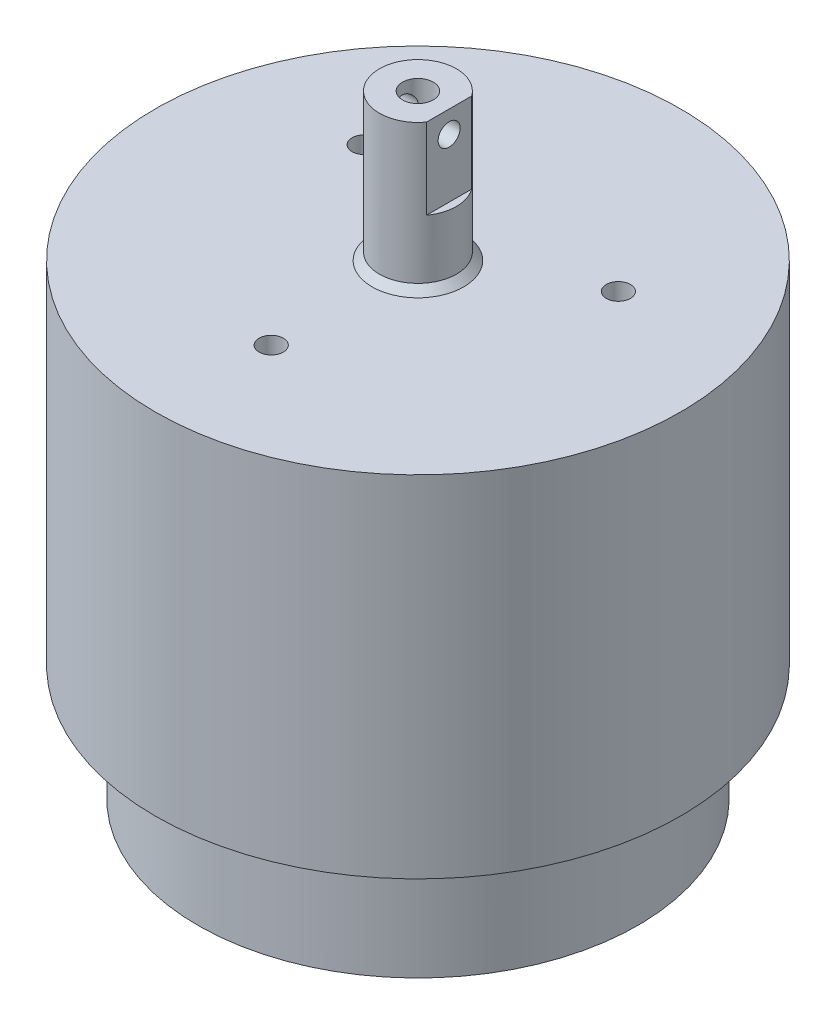
ISO-10303-21;
HEADER;
FILE_DESCRIPTION(('STEP AP214'),'2;1');
FILE_NAME('part.step','',(''),(''),'','','');
FILE_SCHEMA(('AUTOMOTIVE_DESIGN { 1 0 10303 214 1 1 1 1 }'));
ENDSEC;
DATA;
#1=APPLICATION_CONTEXT('core data for automotive mechanical design processes');
#2=APPLICATION_PROTOCOL_DEFINITION('international standard','automotive_design',2000,#1);
#3=PRODUCT_CONTEXT('',#1,'mechanical');
#4=PRODUCT('Part','Part','',(#3));
#5=PRODUCT_RELATED_PRODUCT_CATEGORY('part','',(#4));
#6=PRODUCT_DEFINITION_FORMATION('','',#4);
#7=PRODUCT_DEFINITION_CONTEXT('part definition',#1,'design');
#8=PRODUCT_DEFINITION('design','',#6,#7);
#9=PRODUCT_DEFINITION_SHAPE('','',#8);
#10=(LENGTH_UNIT() NAMED_UNIT(*) SI_UNIT(.MILLI.,.METRE.));
#11=(NAMED_UNIT(*) PLANE_ANGLE_UNIT() SI_UNIT($,.RADIAN.));
#12=(NAMED_UNIT(*) SI_UNIT($,.STERADIAN.) SOLID_ANGLE_UNIT());
#13=UNCERTAINTY_MEASURE_WITH_UNIT(LENGTH_MEASURE(1.E-05),#10,'distance_accuracy_value','');
#14=(GEOMETRIC_REPRESENTATION_CONTEXT(3) GLOBAL_UNCERTAINTY_ASSIGNED_CONTEXT((#13)) GLOBAL_UNIT_ASSIGNED_CONTEXT((#10,
#11,#12)) REPRESENTATION_CONTEXT('',''));
#15=CARTESIAN_POINT('',(0.,0.,0.));
#16=DIRECTION('',(0.,0.,1.));
#17=DIRECTION('',(1.,0.,0.));
#18=AXIS2_PLACEMENT_3D('',#15,#16,#17);
#19=CARTESIAN_POINT('',(0.,0.,0.));
#20=DIRECTION('',(0.,1.,0.));
#21=DIRECTION('',(0.,0.,1.));
#22=AXIS2_PLACEMENT_3D('',#19,#20,#21);
#23=PLANE('',#22);
#24=DIRECTION('',(1.,0.,0.));
#25=VECTOR('',#24,1.);
#26=CARTESIAN_POINT('',(-68.4,0.,-26.8));
#27=LINE('',#26,#25);
#28=CARTESIAN_POINT('',(-13.4818396370822,0.,-26.8));
#29=VERTEX_POINT('',#28);
#30=CARTESIAN_POINT('',(13.4818396370822,0.,-26.8));
#31=VERTEX_POINT('',#30);
#32=EDGE_CURVE('E52',#29,#31,#27,.T.);
#33=ORIENTED_EDGE('',*,*,#32,.F.);
#34=CARTESIAN_POINT('',(0.,0.,0.));
#35=DIRECTION('',(0.,1.,0.));
#36=DIRECTION('',(0.,0.,1.));
#37=AXIS2_PLACEMENT_3D('',#34,#35,#36);
#38=CIRCLE('',#37,30.);
#39=EDGE_CURVE('E89',#31,#29,#38,.F.);
#40=ORIENTED_EDGE('',*,*,#39,.F.);
#41=EDGE_LOOP('',(#33,#40));
#42=FACE_BOUND('',#41,.T.);
#43=CARTESIAN_POINT('',(0.,0.,0.));
#44=DIRECTION('',(0.,1.,0.));
#45=DIRECTION('',(0.,0.,1.));
#46=AXIS2_PLACEMENT_3D('',#43,#44,#45);
#47=CIRCLE('',#46,35.8);
#48=CARTESIAN_POINT('',(0.,0.,35.8));
#49=VERTEX_POINT('',#48);
#50=EDGE_CURVE('E179',#49,#49,#47,.T.);
#51=ORIENTED_EDGE('',*,*,#50,.F.);
#52=EDGE_LOOP('',(#51));
#53=FACE_BOUND('',#52,.T.);
#54=ADVANCED_FACE('F38',(#42,#53),#23,.F.);
#55=CARTESIAN_POINT('',(-35.8,64.7,0.));
#56=DIRECTION('',(1.,0.,0.));
#57=DIRECTION('',(0.,0.,-1.));
#58=AXIS2_PLACEMENT_3D('',#55,#56,#57);
#59=CYLINDRICAL_SURFACE('',#58,1.5);
#60=CARTESIAN_POINT('',(-1.46969384566991,64.7,-1.5));
#61=CARTESIAN_POINT('',(-1.46969165930968,64.7714635636139,-1.50000136654578));
#62=CARTESIAN_POINT('',(-1.47500932637416,64.8429207403161,-1.49484568464259));
#63=CARTESIAN_POINT('',(-1.49509778142078,64.9831501533784,-1.47474413498796));
#64=CARTESIAN_POINT('',(-1.50989183818347,65.0519153374449,-1.45977416663717));
#65=CARTESIAN_POINT('',(-1.54608690956729,65.184150557969,-1.42137043457249));
#66=CARTESIAN_POINT('',(-1.56740847183025,65.2476732010485,-1.39803790596236));
#67=CARTESIAN_POINT('',(-1.61411338226234,65.3697344167392,-1.34384442045294));
#68=CARTESIAN_POINT('',(-1.63949657223534,65.4282731833312,-1.31298375674207));
#69=CARTESIAN_POINT('',(-1.69703920681543,65.5505097655526,-1.23801434968526));
#70=CARTESIAN_POINT('',(-1.72958548266557,65.6131709629904,-1.19251231937905));
#71=CARTESIAN_POINT('',(-1.79453481625315,65.7309030748407,-1.09234569430987));
#72=CARTESIAN_POINT('',(-1.82693762546001,65.7859637671573,-1.03766897496788));
#73=CARTESIAN_POINT('',(-1.89464454418695,65.8966278927636,-0.909114118883169));
#74=CARTESIAN_POINT('',(-1.92945000277546,65.9506089564553,-0.833550251339773));
#75=CARTESIAN_POINT('',(-1.99163539004082,66.0445616887617,-0.671471184072257));
#76=CARTESIAN_POINT('',(-2.01903090484714,66.0845628155065,-0.584979541461412));
#77=CARTESIAN_POINT('',(-2.0568573791985,66.1390714423057,-0.428823654563336));
#78=CARTESIAN_POINT('',(-2.06988765494728,66.157575484144,-0.361173149474201));
#79=CARTESIAN_POINT('',(-2.08928275459017,66.184991166103,-0.223037025629692));
#80=CARTESIAN_POINT('',(-2.09565302694576,66.1939106473936,-0.15255377341014));
#81=CARTESIAN_POINT('',(-2.10117694036723,66.2016496965512,-0.0105972322099037));
#82=CARTESIAN_POINT('',(-2.10031527792017,66.2004478466291,0.0608778365420269));
#83=CARTESIAN_POINT('',(-2.09141900536098,66.1879691760126,0.202492055658266));
#84=CARTESIAN_POINT('',(-2.08338248354529,66.1766896701791,0.272630844890636));
#85=CARTESIAN_POINT('',(-2.06113132668599,66.1451239567931,0.407816198169333));
#86=CARTESIAN_POINT('',(-2.04708263262734,66.1250793700523,0.472947719355316));
#87=CARTESIAN_POINT('',(-2.01388317467698,66.0769633290989,0.598759663359012));
#88=CARTESIAN_POINT('',(-1.99473137301589,66.0488902421232,0.659439177610707));
#89=CARTESIAN_POINT('',(-1.95018428161982,65.9821488941787,0.781979515918934));
#90=CARTESIAN_POINT('',(-1.92433092548092,65.9426482445541,0.843217563738527));
#91=CARTESIAN_POINT('',(-1.86956492969856,65.8560275902243,0.958546642695754));
#92=CARTESIAN_POINT('',(-1.84064919856859,65.8088998601011,1.01263032520683));
#93=CARTESIAN_POINT('',(-1.77613984520874,65.6985214290082,1.12253959533404));
#94=CARTESIAN_POINT('',(-1.74029823421898,65.6339002110004,1.1768465307683));
#95=CARTESIAN_POINT('',(-1.67027791346609,65.4958482268797,1.27426961124233));
#96=CARTESIAN_POINT('',(-1.6360991117621,65.4224179486216,1.31738637558721));
#97=CARTESIAN_POINT('',(-1.5807777200218,65.2847012905478,1.38295023832981));
#98=CARTESIAN_POINT('',(-1.55843290737092,65.2220812754251,1.40786555789215));
#99=CARTESIAN_POINT('',(-1.51991323882907,65.0923666770235,1.4493682425193));
#100=CARTESIAN_POINT('',(-1.50372697519068,65.0252806399897,1.46597102346706));
#101=CARTESIAN_POINT('',(-1.47997847836866,64.8870650724588,1.48995559401033));
#102=CARTESIAN_POINT('',(-1.47251842056757,64.8158976759758,1.49722823022055));
#103=CARTESIAN_POINT('',(-1.46821177064601,64.6729509624099,1.50145580341694));
#104=CARTESIAN_POINT('',(-1.47135761475232,64.6011721178168,1.49841809338555));
#105=CARTESIAN_POINT('',(-1.4862179505167,64.4711657218677,1.48365443178122));
#106=CARTESIAN_POINT('',(-1.4964991965727,64.4125897811243,1.47337792994044));
#107=CARTESIAN_POINT('',(-1.52260578901432,64.2982114735756,1.44638320728362));
#108=CARTESIAN_POINT('',(-1.53843765878242,64.2424124588593,1.42965740459433));
#109=CARTESIAN_POINT('',(-1.58254090823628,64.108243566708,1.38097343084555));
#110=CARTESIAN_POINT('',(-1.61313549796306,64.0318968007285,1.34555737538804));
#111=CARTESIAN_POINT('',(-1.67819313243434,63.8872776876105,1.26349530316507));
#112=CARTESIAN_POINT('',(-1.71266384591532,63.8190219159808,1.21682680768471));
#113=CARTESIAN_POINT('',(-1.78263899408262,63.6896444385997,1.111876746708));
#114=CARTESIAN_POINT('',(-1.81814914820308,63.6287195316445,1.05335590564381));
#115=CARTESIAN_POINT('',(-1.8861982097656,63.5169093019218,0.925990119024709));
#116=CARTESIAN_POINT('',(-1.91874117814137,63.466010143529,0.857159635254306));
#117=CARTESIAN_POINT('',(-1.97355695532268,63.3825173160364,0.72086207062022));
#118=CARTESIAN_POINT('',(-1.9966369574586,63.3483291724234,0.654701792827803));
#119=CARTESIAN_POINT('',(-2.03677203003265,63.2897171605615,0.516456587915639));
#120=CARTESIAN_POINT('',(-2.05383052732656,63.2652877375508,0.444375059484916));
#121=CARTESIAN_POINT('',(-2.08048595093181,63.2273813967837,0.295508306422581));
#122=CARTESIAN_POINT('',(-2.09003481122841,63.2139750083805,0.218696121210112));
#123=CARTESIAN_POINT('',(-2.10048455576969,63.1993123233693,0.063345450159648));
#124=CARTESIAN_POINT('',(-2.10138999521387,63.198049626869,-0.0151921045079223));
#125=CARTESIAN_POINT('',(-2.09484940357417,63.2072173341615,-0.162689602153977));
#126=CARTESIAN_POINT('',(-2.08829003391129,63.2164062433253,-0.231772127939286));
#127=CARTESIAN_POINT('',(-2.06879045843107,63.2439818401701,-0.367128348695411));
#128=CARTESIAN_POINT('',(-2.05584917022157,63.2623700880937,-0.433401565127795));
#129=CARTESIAN_POINT('',(-2.02420489180258,63.307993665386,-0.563173310350435));
#130=CARTESIAN_POINT('',(-2.00537359742541,63.3354268252546,-0.626569976308402));
#131=CARTESIAN_POINT('',(-1.96336858423812,63.3979433720807,-0.747870090713514));
#132=CARTESIAN_POINT('',(-1.94019406405212,63.4330281710508,-0.805772522435653));
#133=CARTESIAN_POINT('',(-1.88707875962302,63.515841562924,-0.923986959254949));
#134=CARTESIAN_POINT('',(-1.85664563422283,63.564685505515,-0.983294495655166));
#135=CARTESIAN_POINT('',(-1.79399906606271,63.6703187138756,-1.0934320888604));
#136=CARTESIAN_POINT('',(-1.76178239308847,63.7271227012664,-1.14424604653133));
#137=CARTESIAN_POINT('',(-1.69251482816939,63.8584199117439,-1.24487931564336));
#138=CARTESIAN_POINT('',(-1.65558627022475,63.9342749797694,-1.29302213478842));
#139=CARTESIAN_POINT('',(-1.58751047818561,64.0954416102156,-1.37574602319549));
#140=CARTESIAN_POINT('',(-1.55635298353236,64.1807359502617,-1.4103512855809));
#141=CARTESIAN_POINT('',(-1.51212917512403,64.3383474061182,-1.45748481316448));
#142=CARTESIAN_POINT('',(-1.49652391532485,64.4089374180378,-1.47330401471641));
#143=CARTESIAN_POINT('',(-1.47532311152695,64.5530271370526,-1.49454455651674));
#144=CARTESIAN_POINT('',(-1.46969609381458,64.6265169450203,-1.49999859483696));
#145=CARTESIAN_POINT('',(-1.46969384566991,64.7,-1.5));
#146=B_SPLINE_CURVE_WITH_KNOTS('',3,(#60,#61,#62,#63,#64,#65,#66,#67,#68,#69,#70,#71,#72,#73,
#74,#75,#76,#77,#78,#79,#80,#81,#82,#83,#84,#85,#86,#87,#88,#89,#90,#91,#92,#93,#94,#95,#96,#97,
#98,#99,#100,#101,#102,#103,#104,#105,#106,#107,#108,#109,#110,#111,#112,#113,#114,#115,#116,
#117,#118,#119,#120,#121,#122,#123,#124,#125,#126,#127,#128,#129,#130,#131,#132,#133,#134,#135,
#136,#137,#138,#139,#140,#141,#142,#143,#144,#145),.UNSPECIFIED.,.T.,.F.,(4,2,2,2,2,2,2,2,2,2,2,
2,2,2,2,2,2,2,2,2,2,2,2,2,2,2,2,2,2,2,2,2,2,2,2,2,2,2,2,2,2,2,4),(0.,0.214041341565737,
0.428610275712231,0.640664871601888,0.852711210197116,1.1038257335541,1.35527476295182,
1.65114310955598,1.94638419755255,2.15947902773156,2.37239939108386,2.58577042909477,
2.79919833566905,3.00708108528785,3.21500614230807,3.44611668475213,3.6774627996914,
3.95147971727035,4.22548146651265,4.43776026411788,4.64964391165515,4.86398443491504,
5.07817213005319,5.25849876334789,5.43903804027736,5.70624218404043,5.97398460292707,
6.24779650448657,6.52122785421028,6.75417807949538,6.98699551758335,7.22129126143327,
7.45546352144085,7.66448115880025,7.87353425836437,8.08750217454558,8.30150960924386,
8.54850648356673,8.79596634520385,9.08601786485981,9.37554863589217,9.59633624226799,
9.81642618565758),.UNSPECIFIED.);
#147=CARTESIAN_POINT('',(-1.46969384566991,64.7,-1.5));
#148=VERTEX_POINT('',#147);
#149=EDGE_CURVE('E98',#148,#148,#146,.T.);
#150=ORIENTED_EDGE('',*,*,#149,.T.);
#151=EDGE_LOOP('',(#150));
#152=FACE_BOUND('',#151,.T.);
#153=CARTESIAN_POINT('',(-5.03115294937453,64.7,-1.5));
#154=CARTESIAN_POINT('',(-5.03115410257282,64.7823886534079,-1.49999851534795));
#155=CARTESIAN_POINT('',(-5.03319884759406,64.8647923131909,-1.49318899949663));
#156=CARTESIAN_POINT('',(-5.04112791905326,65.0272034291472,-1.46619272542646));
#157=CARTESIAN_POINT('',(-5.04701380722367,65.1072098968255,-1.4460005260225));
#158=CARTESIAN_POINT('',(-5.06190532141159,65.2624529006536,-1.3929700746965));
#159=CARTESIAN_POINT('',(-5.07090611443027,65.3376966138629,-1.36015140488905));
#160=CARTESIAN_POINT('',(-5.0910069082211,65.4816258586658,-1.28286273047202));
#161=CARTESIAN_POINT('',(-5.10210715818896,65.5503106102835,-1.23839134249759));
#162=CARTESIAN_POINT('',(-5.12551337410616,65.6811436739862,-1.13769360073649));
#163=CARTESIAN_POINT('',(-5.13784316973113,65.7430758515969,-1.08119190834937));
#164=CARTESIAN_POINT('',(-5.16211474134014,65.8567270874779,-0.958628434101947));
#165=CARTESIAN_POINT('',(-5.17405647175239,65.9084449498421,-0.892565534369719));
#166=CARTESIAN_POINT('',(-5.19647499001134,66.0011214862651,-0.751234524118184));
#167=CARTESIAN_POINT('',(-5.2069204087565,66.0418622148132,-0.675818087821388));
#168=CARTESIAN_POINT('',(-5.22489405364148,66.110001330812,-0.518856356429715));
#169=CARTESIAN_POINT('',(-5.23242284768149,66.1374023159302,-0.437312258156366));
#170=CARTESIAN_POINT('',(-5.24354639475177,66.1773758459298,-0.272668931340872));
#171=CARTESIAN_POINT('',(-5.24723870258477,66.1903167662785,-0.189665848596768));
#172=CARTESIAN_POINT('',(-5.2506157174477,66.2021650504124,-0.0225900768164312));
#173=CARTESIAN_POINT('',(-5.25030119054237,66.201075096753,0.0614824046914218));
#174=CARTESIAN_POINT('',(-5.2457700507248,66.1851452188115,0.225735146801425));
#175=CARTESIAN_POINT('',(-5.24166653082038,66.1707037905215,0.305957659581719));
#176=CARTESIAN_POINT('',(-5.23015414747602,66.1291286731517,0.462789166633221));
#177=CARTESIAN_POINT('',(-5.22274508292168,66.1019942118034,0.539397940725388));
#178=CARTESIAN_POINT('',(-5.20529273829083,66.0355179493911,0.687805375296698));
#179=CARTESIAN_POINT('',(-5.195221541341,65.9960459166438,0.759542282888085));
#180=CARTESIAN_POINT('',(-5.17352076730531,65.9061165602015,0.895505432692867));
#181=CARTESIAN_POINT('',(-5.16189084893963,65.8556568292502,0.959730024312011));
#182=CARTESIAN_POINT('',(-5.13784262264717,65.7430957170361,1.08122448641082));
#183=CARTESIAN_POINT('',(-5.1254109702704,65.6806479247962,1.13817118318868));
#184=CARTESIAN_POINT('',(-5.10152230340244,65.5469636811155,1.24086976181233));
#185=CARTESIAN_POINT('',(-5.09006536804024,65.4757265172883,1.28662073533696));
#186=CARTESIAN_POINT('',(-5.06936381110807,65.3257018366265,1.36592501989086));
#187=CARTESIAN_POINT('',(-5.06013758203982,65.2468585812113,1.39937803341579));
#188=CARTESIAN_POINT('',(-5.04516408290506,65.0843351273715,1.45244213622068));
#189=CARTESIAN_POINT('',(-5.03941580065156,65.0006563440051,1.47205725302032));
#190=CARTESIAN_POINT('',(-5.03226836397145,64.8338896817508,1.49630562899914));
#191=CARTESIAN_POINT('',(-5.03072783487502,64.7508786373002,1.50142611118016));
#192=CARTESIAN_POINT('',(-5.0317811969763,64.5851837630593,1.49789247539749));
#193=CARTESIAN_POINT('',(-5.03437457244426,64.5024998937418,1.48924007568482));
#194=CARTESIAN_POINT('',(-5.04326572540292,64.3417690789828,1.45883836069446));
#195=CARTESIAN_POINT('',(-5.04947732224088,64.2636593104886,1.43739346638105));
#196=CARTESIAN_POINT('',(-5.06481797948048,64.1121485960017,1.38236371399822));
#197=CARTESIAN_POINT('',(-5.07394746083355,64.0387483312658,1.34877710420076));
#198=CARTESIAN_POINT('',(-5.09437641007042,63.8967334435875,1.26946473841217));
#199=CARTESIAN_POINT('',(-5.10572398035841,63.8282821668484,1.22345918796849));
#200=CARTESIAN_POINT('',(-5.12920294912374,63.6998927199175,1.12095347763631));
#201=CARTESIAN_POINT('',(-5.14133451710709,63.6399563997409,1.06445104326102));
#202=CARTESIAN_POINT('',(-5.16551045577065,63.5282154362839,0.940281007474156));
#203=CARTESIAN_POINT('',(-5.17753804534607,63.476753771436,0.8723007826804));
#204=CARTESIAN_POINT('',(-5.19973482784499,63.385965738963,0.72838898029315));
#205=CARTESIAN_POINT('',(-5.20990411789059,63.3466387370582,0.65245781857363));
#206=CARTESIAN_POINT('',(-5.22717378634804,63.2816117847303,0.495324954717119));
#207=CARTESIAN_POINT('',(-5.23429731095436,63.2558087078104,0.414168599924721));
#208=CARTESIAN_POINT('',(-5.24477504717914,63.2182798985449,0.248434236412438));
#209=CARTESIAN_POINT('',(-5.24813022842264,63.206550544864,0.163857113689074));
#210=CARTESIAN_POINT('',(-5.25064001252463,63.1977564245017,-0.00313367846927627));
#211=CARTESIAN_POINT('',(-5.24993777691747,63.2001918881879,-0.0855192232874726));
#212=CARTESIAN_POINT('',(-5.24474301841601,63.2184787110577,-0.248658879316509));
#213=CARTESIAN_POINT('',(-5.24025067702944,63.2343294277865,-0.329413068463154));
#214=CARTESIAN_POINT('',(-5.22801601395087,63.2786985207341,-0.486303099779698));
#215=CARTESIAN_POINT('',(-5.2203031053613,63.307102384208,-0.562473775076298));
#216=CARTESIAN_POINT('',(-5.20242820607589,63.3756696187141,-0.709010402071107));
#217=CARTESIAN_POINT('',(-5.19226583626338,63.4158348103192,-0.779375452935519));
#218=CARTESIAN_POINT('',(-5.17019216580141,63.5081730030686,-0.914575092265437));
#219=CARTESIAN_POINT('',(-5.15823784339672,63.5606675650913,-0.979182996005307));
#220=CARTESIAN_POINT('',(-5.13408048739897,63.6755818440905,-1.09884091673879));
#221=CARTESIAN_POINT('',(-5.12187738590337,63.7380043033136,-1.15388828414236));
#222=CARTESIAN_POINT('',(-5.09823028157902,63.8729726877466,-1.25430634521845));
#223=CARTESIAN_POINT('',(-5.08681463826367,63.9457414606276,-1.29938487542696));
#224=CARTESIAN_POINT('',(-5.0664633399873,64.098141398986,-1.37660957714715));
#225=CARTESIAN_POINT('',(-5.05752629789876,64.1777686933163,-1.40876298663646));
#226=CARTESIAN_POINT('',(-5.04418844667444,64.3307402751745,-1.45573900509351));
#227=CARTESIAN_POINT('',(-5.03934329125491,64.4035177610769,-1.47229424986293));
#228=CARTESIAN_POINT('',(-5.03282527099894,64.550859588764,-1.49442455282772));
#229=CARTESIAN_POINT('',(-5.03115190552542,64.6254236466733,-1.5000013438736));
#230=CARTESIAN_POINT('',(-5.03115294937453,64.7,-1.5));
#231=B_SPLINE_CURVE_WITH_KNOTS('',3,(#153,#154,#155,#156,#157,#158,#159,#160,#161,#162,#163,
#164,#165,#166,#167,#168,#169,#170,#171,#172,#173,#174,#175,#176,#177,#178,#179,#180,#181,#182,
#183,#184,#185,#186,#187,#188,#189,#190,#191,#192,#193,#194,#195,#196,#197,#198,#199,#200,#201,
#202,#203,#204,#205,#206,#207,#208,#209,#210,#211,#212,#213,#214,#215,#216,#217,#218,#219,#220,
#221,#222,#223,#224,#225,#226,#227,#228,#229,#230),.UNSPECIFIED.,.T.,.F.,(4,2,2,2,2,2,2,2,2,2,2,
2,2,2,2,2,2,2,2,2,2,2,2,2,2,2,2,2,2,2,2,2,2,2,2,2,2,2,4),(0.,0.246891256772974,
0.493882957214153,0.740493137802345,0.98713260825553,1.24017875404964,1.49325450928864,
1.75103612260386,2.00876751763281,2.25977175771558,2.51072800914315,2.75442778232567,
2.99814238459892,3.2445217753387,3.49095519888626,3.74603709519751,4.00113967972321,
4.25827890472507,4.51534325844759,4.76365772500111,5.01194121523838,5.25453967242382,
5.49717314412031,5.74581004531786,5.9945008846508,6.25159041282494,6.50866650063486,
6.76375263973568,7.01877312807479,7.26485173263046,7.51091855317932,7.7547855929191,
7.99869040157418,8.2498482655903,8.50107562436486,8.75890209315981,9.01658397911739,
9.24009966649871,9.46358007110252),.UNSPECIFIED.);
#232=CARTESIAN_POINT('',(-5.03115294937453,64.7,-1.5));
#233=VERTEX_POINT('',#232);
#234=EDGE_CURVE('E195',#233,#233,#231,.T.);
#235=ORIENTED_EDGE('',*,*,#234,.F.);
#236=EDGE_LOOP('',(#235));
#237=FACE_BOUND('',#236,.T.);
#238=ADVANCED_FACE('F153',(#152,#237),#59,.F.);
#239=CARTESIAN_POINT('',(0.,47.7,0.));
#240=DIRECTION('',(0.,1.,0.));
#241=DIRECTION('',(0.,0.,1.));
#242=AXIS2_PLACEMENT_3D('',#239,#240,#241);
#243=PLANE('',#242);
#244=CARTESIAN_POINT('',(-17.3205080756888,47.7,-10.));
#245=DIRECTION('',(0.,1.,0.));
#246=DIRECTION('',(0.,0.,1.));
#247=AXIS2_PLACEMENT_3D('',#244,#245,#246);
#248=CIRCLE('',#247,1.65);
#249=CARTESIAN_POINT('',(-17.3205080756888,47.7,-8.35));
#250=VERTEX_POINT('',#249);
#251=EDGE_CURVE('E106',#250,#250,#248,.T.);
#252=ORIENTED_EDGE('',*,*,#251,.F.);
#253=EDGE_LOOP('',(#252));
#254=FACE_BOUND('',#253,.T.);
#255=CARTESIAN_POINT('',(0.,47.7,20.));
#256=DIRECTION('',(0.,1.,0.));
#257=DIRECTION('',(0.,0.,1.));
#258=AXIS2_PLACEMENT_3D('',#255,#256,#257);
#259=CIRCLE('',#258,1.65);
#260=CARTESIAN_POINT('',(0.,47.7,21.65));
#261=VERTEX_POINT('',#260);
#262=EDGE_CURVE('E407',#261,#261,#259,.T.);
#263=ORIENTED_EDGE('',*,*,#262,.F.);
#264=EDGE_LOOP('',(#263));
#265=FACE_BOUND('',#264,.T.);
#266=CARTESIAN_POINT('',(17.3205080756888,47.7,-10.));
#267=DIRECTION('',(0.,1.,0.));
#268=DIRECTION('',(0.,0.,1.));
#269=AXIS2_PLACEMENT_3D('',#266,#267,#268);
#270=CIRCLE('',#269,1.64999999999995);
#271=CARTESIAN_POINT('',(17.3205080756888,47.7,-8.35000000000006));
#272=VERTEX_POINT('',#271);
#273=EDGE_CURVE('E413',#272,#272,#270,.T.);
#274=ORIENTED_EDGE('',*,*,#273,.F.);
#275=EDGE_LOOP('',(#274));
#276=FACE_BOUND('',#275,.T.);
#277=CARTESIAN_POINT('',(0.,47.7,0.));
#278=DIRECTION('',(0.,1.,0.));
#279=DIRECTION('',(0.,0.,1.));
#280=AXIS2_PLACEMENT_3D('',#277,#278,#279);
#281=CIRCLE('',#280,6.24999999999998);
#282=CARTESIAN_POINT('',(0.,47.7,6.24999999999998));
#283=VERTEX_POINT('',#282);
#284=EDGE_CURVE('E91',#283,#283,#281,.F.);
#285=ORIENTED_EDGE('',*,*,#284,.T.);
#286=EDGE_LOOP('',(#285));
#287=FACE_BOUND('',#286,.T.);
#288=CARTESIAN_POINT('',(0.,47.7,0.));
#289=DIRECTION('',(0.,1.,0.));
#290=DIRECTION('',(0.,0.,1.));
#291=AXIS2_PLACEMENT_3D('',#288,#289,#290);
#292=CIRCLE('',#291,35.8);
#293=CARTESIAN_POINT('',(0.,47.7,35.8));
#294=VERTEX_POINT('',#293);
#295=EDGE_CURVE('E176',#294,#294,#292,.T.);
#296=ORIENTED_EDGE('',*,*,#295,.T.);
#297=EDGE_LOOP('',(#296));
#298=FACE_BOUND('',#297,.T.);
#299=ADVANCED_FACE('F158',(#254,#265,#276,#287,#298),#243,.T.);
#300=CARTESIAN_POINT('',(0.,47.7,0.));
#301=DIRECTION('',(0.,-1.,0.));
#302=DIRECTION('',(0.,0.,-1.));
#303=AXIS2_PLACEMENT_3D('',#300,#301,#302);
#304=CYLINDRICAL_SURFACE('',#303,35.8);
#305=ORIENTED_EDGE('',*,*,#295,.F.);
#306=EDGE_LOOP('',(#305));
#307=FACE_BOUND('',#306,.T.);
#308=ORIENTED_EDGE('',*,*,#50,.T.);
#309=EDGE_LOOP('',(#308));
#310=FACE_BOUND('',#309,.T.);
#311=ADVANCED_FACE('F162',(#307,#310),#304,.T.);
#312=CARTESIAN_POINT('',(0.,67.7,0.));
#313=DIRECTION('',(0.,-1.,0.));
#314=DIRECTION('',(0.,0.,-1.));
#315=AXIS2_PLACEMENT_3D('',#312,#313,#314);
#316=CYLINDRICAL_SURFACE('',#315,5.25);
#317=CARTESIAN_POINT('',(0.,48.7,0.));
#318=DIRECTION('',(0.,1.,0.));
#319=DIRECTION('',(0.,0.,1.));
#320=AXIS2_PLACEMENT_3D('',#317,#318,#319);
#321=CIRCLE('',#320,5.25);
#322=CARTESIAN_POINT('',(0.,48.7,5.25));
#323=VERTEX_POINT('',#322);
#324=EDGE_CURVE('E95',#323,#323,#321,.T.);
#325=ORIENTED_EDGE('',*,*,#324,.T.);
#326=EDGE_LOOP('',(#325));
#327=FACE_BOUND('',#326,.T.);
#328=ORIENTED_EDGE('',*,*,#234,.T.);
#329=EDGE_LOOP('',(#328));
#330=FACE_BOUND('',#329,.T.);
#331=CARTESIAN_POINT('',(0.,67.7,0.));
#332=DIRECTION('',(0.,1.,0.));
#333=DIRECTION('',(0.,0.,1.));
#334=AXIS2_PLACEMENT_3D('',#331,#332,#333);
#335=CIRCLE('',#334,5.25);
#336=CARTESIAN_POINT('',(4.25,67.7,-3.08220700148449));
#337=VERTEX_POINT('',#336);
#338=CARTESIAN_POINT('',(4.25,67.7,3.08220700148449));
#339=VERTEX_POINT('',#338);
#340=EDGE_CURVE('E180',#337,#339,#335,.T.);
#341=ORIENTED_EDGE('',*,*,#340,.F.);
#342=DIRECTION('',(0.,1.,0.));
#343=VECTOR('',#342,1.);
#344=CARTESIAN_POINT('',(4.25,56.7,-3.08220700148449));
#345=LINE('',#344,#343);
#346=CARTESIAN_POINT('',(4.25,56.7,-3.08220700148449));
#347=VERTEX_POINT('',#346);
#348=EDGE_CURVE('E60',#347,#337,#345,.T.);
#349=ORIENTED_EDGE('',*,*,#348,.F.);
#350=CARTESIAN_POINT('',(0.,56.7,0.));
#351=DIRECTION('',(0.,1.,0.));
#352=DIRECTION('',(0.,0.,1.));
#353=AXIS2_PLACEMENT_3D('',#350,#351,#352);
#354=CIRCLE('',#353,5.25);
#355=CARTESIAN_POINT('',(4.25,56.7,3.08220700148449));
#356=VERTEX_POINT('',#355);
#357=EDGE_CURVE('E182',#356,#347,#354,.T.);
#358=ORIENTED_EDGE('',*,*,#357,.F.);
#359=DIRECTION('',(0.,1.,0.));
#360=VECTOR('',#359,1.);
#361=CARTESIAN_POINT('',(4.25,56.7,3.08220700148449));
#362=LINE('',#361,#360);
#363=EDGE_CURVE('E199',#356,#339,#362,.T.);
#364=ORIENTED_EDGE('',*,*,#363,.T.);
#365=EDGE_LOOP('',(#341,#349,#358,#364));
#366=FACE_BOUND('',#365,.T.);
#367=ADVANCED_FACE('F164',(#327,#330,#366),#316,.T.);
#368=CARTESIAN_POINT('',(0.,67.7,0.));
#369=DIRECTION('',(0.,1.,0.));
#370=DIRECTION('',(0.,0.,1.));
#371=AXIS2_PLACEMENT_3D('',#368,#369,#370);
#372=PLANE('',#371);
#373=CARTESIAN_POINT('',(0.,67.7,0.));
#374=DIRECTION('',(0.,1.,0.));
#375=DIRECTION('',(0.,0.,1.));
#376=AXIS2_PLACEMENT_3D('',#373,#374,#375);
#377=CIRCLE('',#376,2.1);
#378=CARTESIAN_POINT('',(0.,67.7,2.1));
#379=VERTEX_POINT('',#378);
#380=EDGE_CURVE('E395',#379,#379,#377,.T.);
#381=ORIENTED_EDGE('',*,*,#380,.F.);
#382=EDGE_LOOP('',(#381));
#383=FACE_BOUND('',#382,.T.);
#384=DIRECTION('',(0.,0.,1.));
#385=VECTOR('',#384,1.);
#386=CARTESIAN_POINT('',(4.25,67.7,-3.08220700148449));
#387=LINE('',#386,#385);
#388=EDGE_CURVE('E201',#337,#339,#387,.T.);
#389=ORIENTED_EDGE('',*,*,#388,.F.);
#390=ORIENTED_EDGE('',*,*,#340,.T.);
#391=EDGE_LOOP('',(#389,#390));
#392=FACE_BOUND('',#391,.T.);
#393=ADVANCED_FACE('F170',(#383,#392),#372,.T.);
#394=CARTESIAN_POINT('',(0.,56.7,0.));
#395=DIRECTION('',(0.,1.,0.));
#396=DIRECTION('',(0.,0.,1.));
#397=AXIS2_PLACEMENT_3D('',#394,#395,#396);
#398=PLANE('',#397);
#399=ORIENTED_EDGE('',*,*,#357,.T.);
#400=DIRECTION('',(0.,0.,1.));
#401=VECTOR('',#400,1.);
#402=CARTESIAN_POINT('',(4.25,56.7,-3.08220700148449));
#403=LINE('',#402,#401);
#404=EDGE_CURVE('E202',#347,#356,#403,.T.);
#405=ORIENTED_EDGE('',*,*,#404,.T.);
#406=EDGE_LOOP('',(#399,#405));
#407=FACE_BOUND('',#406,.T.);
#408=ADVANCED_FACE('F219',(#407),#398,.T.);
#409=CARTESIAN_POINT('',(4.25,56.7,-3.08220700148449));
#410=DIRECTION('',(-1.,0.,0.));
#411=DIRECTION('',(0.,0.,1.));
#412=AXIS2_PLACEMENT_3D('',#409,#410,#411);
#413=PLANE('',#412);
#414=CARTESIAN_POINT('',(4.25,64.7,0.));
#415=DIRECTION('',(1.,0.,0.));
#416=DIRECTION('',(0.,0.,-1.));
#417=AXIS2_PLACEMENT_3D('',#414,#415,#416);
#418=CIRCLE('',#417,1.5);
#419=CARTESIAN_POINT('',(4.25,64.7,-1.5));
#420=VERTEX_POINT('',#419);
#421=EDGE_CURVE('E206',#420,#420,#418,.T.);
#422=ORIENTED_EDGE('',*,*,#421,.F.);
#423=EDGE_LOOP('',(#422));
#424=FACE_BOUND('',#423,.T.);
#425=ORIENTED_EDGE('',*,*,#388,.T.);
#426=ORIENTED_EDGE('',*,*,#363,.F.);
#427=ORIENTED_EDGE('',*,*,#404,.F.);
#428=ORIENTED_EDGE('',*,*,#348,.T.);
#429=EDGE_LOOP('',(#425,#426,#427,#428));
#430=FACE_BOUND('',#429,.T.);
#431=ADVANCED_FACE('F221',(#424,#430),#413,.F.);
#432=CARTESIAN_POINT('',(1.4696938456699,64.7,-1.5));
#433=CARTESIAN_POINT('',(1.46969165930967,64.6285364363861,-1.50000136654578));
#434=CARTESIAN_POINT('',(1.47500932637415,64.557079259684,-1.49484568464259));
#435=CARTESIAN_POINT('',(1.49509778142078,64.4168498466217,-1.47474413498796));
#436=CARTESIAN_POINT('',(1.50989183818347,64.3480846625551,-1.45977416663717));
#437=CARTESIAN_POINT('',(1.54608690956729,64.2158494420311,-1.4213704345725));
#438=CARTESIAN_POINT('',(1.56740847183024,64.1523267989516,-1.39803790596237));
#439=CARTESIAN_POINT('',(1.61411338226233,64.0302655832608,-1.34384442045295));
#440=CARTESIAN_POINT('',(1.63949657223533,63.9717268166688,-1.31298375674208));
#441=CARTESIAN_POINT('',(1.69703920681542,63.8494902344474,-1.23801434968527));
#442=CARTESIAN_POINT('',(1.72958548266557,63.7868290370097,-1.19251231937906));
#443=CARTESIAN_POINT('',(1.79453481625315,63.6690969251593,-1.09234569430987));
#444=CARTESIAN_POINT('',(1.82693762546,63.6140362328428,-1.03766897496789));
#445=CARTESIAN_POINT('',(1.89464454418694,63.5033721072364,-0.909114118883187));
#446=CARTESIAN_POINT('',(1.92945000277545,63.4493910435447,-0.833550251339792));
#447=CARTESIAN_POINT('',(1.99163539004081,63.3554383112383,-0.671471184072281));
#448=CARTESIAN_POINT('',(2.01903090484713,63.3154371844935,-0.584979541461441));
#449=CARTESIAN_POINT('',(2.05685737919849,63.2609285576944,-0.428823654563366));
#450=CARTESIAN_POINT('',(2.06988765494728,63.2424245158561,-0.361173149474226));
#451=CARTESIAN_POINT('',(2.08928275459016,63.215008833897,-0.223037025629714));
#452=CARTESIAN_POINT('',(2.09565302694576,63.2060893526064,-0.152553773410163));
#453=CARTESIAN_POINT('',(2.10117694036723,63.1983503034488,-0.0105972322099279));
#454=CARTESIAN_POINT('',(2.10031527792017,63.1995521533709,0.0608778365420033));
#455=CARTESIAN_POINT('',(2.09141900536098,63.2120308239874,0.202492055658245));
#456=CARTESIAN_POINT('',(2.08338248354529,63.2233103298209,0.272630844890617));
#457=CARTESIAN_POINT('',(2.06113132668599,63.2548760432069,0.407816198169312));
#458=CARTESIAN_POINT('',(2.04708263262734,63.2749206299477,0.472947719355293));
#459=CARTESIAN_POINT('',(2.01388317467699,63.3230366709011,0.59875966335899));
#460=CARTESIAN_POINT('',(1.99473137301589,63.3511097578768,0.659439177610689));
#461=CARTESIAN_POINT('',(1.95018428161982,63.4178511058213,0.781979515918918));
#462=CARTESIAN_POINT('',(1.92433092548092,63.4573517554459,0.843217563738511));
#463=CARTESIAN_POINT('',(1.86956492969857,63.5439724097757,0.95854664269574));
#464=CARTESIAN_POINT('',(1.8406491985686,63.5911001398989,1.01263032520682));
#465=CARTESIAN_POINT('',(1.77613984520875,63.7014785709918,1.12253959533403));
#466=CARTESIAN_POINT('',(1.74029823421899,63.7660997889996,1.17684653076829));
#467=CARTESIAN_POINT('',(1.6702779134661,63.9041517731203,1.27426961124232));
#468=CARTESIAN_POINT('',(1.63609911176211,63.9775820513784,1.31738637558721));
#469=CARTESIAN_POINT('',(1.58077772002181,64.1152987094522,1.38295023832981));
#470=CARTESIAN_POINT('',(1.55843290737092,64.1779187245749,1.40786555789214));
#471=CARTESIAN_POINT('',(1.51991323882907,64.3076333229765,1.44936824251929));
#472=CARTESIAN_POINT('',(1.50372697519069,64.3747193600103,1.46597102346706));
#473=CARTESIAN_POINT('',(1.47997847836867,64.5129349275413,1.48995559401033));
#474=CARTESIAN_POINT('',(1.47251842056757,64.5841023240242,1.49722823022055));
#475=CARTESIAN_POINT('',(1.46821177064601,64.7270490375901,1.50145580341694));
#476=CARTESIAN_POINT('',(1.47135761475232,64.7988278821832,1.49841809338555));
#477=CARTESIAN_POINT('',(1.4862179505167,64.9288342781323,1.48365443178122));
#478=CARTESIAN_POINT('',(1.4964991965727,64.9874102188758,1.47337792994044));
#479=CARTESIAN_POINT('',(1.52260578901432,65.1017885264244,1.44638320728363));
#480=CARTESIAN_POINT('',(1.53843765878241,65.1575875411407,1.42965740459433));
#481=CARTESIAN_POINT('',(1.58254090823627,65.291756433292,1.38097343084555));
#482=CARTESIAN_POINT('',(1.61313549796305,65.3681031992715,1.34555737538805));
#483=CARTESIAN_POINT('',(1.67819313243433,65.5127223123895,1.26349530316508));
#484=CARTESIAN_POINT('',(1.71266384591532,65.5809780840193,1.21682680768472));
#485=CARTESIAN_POINT('',(1.78263899408261,65.7103555614003,1.11187674670802));
#486=CARTESIAN_POINT('',(1.81814914820307,65.7712804683555,1.05335590564383));
#487=CARTESIAN_POINT('',(1.88619820976559,65.8830906980782,0.925990119024738));
#488=CARTESIAN_POINT('',(1.91874117814135,65.933989856471,0.857159635254341));
#489=CARTESIAN_POINT('',(1.97355695532266,66.0174826839635,0.720862070620261));
#490=CARTESIAN_POINT('',(1.99663695745858,66.0516708275765,0.654701792827844));
#491=CARTESIAN_POINT('',(2.03677203003264,66.1102828394385,0.516456587915682));
#492=CARTESIAN_POINT('',(2.05383052732655,66.1347122624492,0.44437505948496));
#493=CARTESIAN_POINT('',(2.0804859509318,66.1726186032163,0.295508306422626));
#494=CARTESIAN_POINT('',(2.09003481122841,66.1860249916195,0.218696121210157));
#495=CARTESIAN_POINT('',(2.10048455576969,66.2006876766307,0.0633454501596908));
#496=CARTESIAN_POINT('',(2.10138999521388,66.201950373131,-0.0151921045078811));
#497=CARTESIAN_POINT('',(2.09484940357417,66.1927826658385,-0.162689602153941));
#498=CARTESIAN_POINT('',(2.08829003391129,66.1835937566748,-0.231772127939253));
#499=CARTESIAN_POINT('',(2.06879045843107,66.15601815983,-0.367128348695382));
#500=CARTESIAN_POINT('',(2.05584917022158,66.1376299119063,-0.433401565127764));
#501=CARTESIAN_POINT('',(2.02420489180258,66.092006334614,-0.56317331035041));
#502=CARTESIAN_POINT('',(2.00537359742541,66.0645731747454,-0.626569976308383));
#503=CARTESIAN_POINT('',(1.96336858423813,66.0020566279193,-0.747870090713495));
#504=CARTESIAN_POINT('',(1.94019406405213,65.9669718289492,-0.805772522435629));
#505=CARTESIAN_POINT('',(1.88707875962304,65.884158437076,-0.923986959254927));
#506=CARTESIAN_POINT('',(1.85664563422284,65.835314494485,-0.983294495655151));
#507=CARTESIAN_POINT('',(1.79399906606272,65.7296812861244,-1.09343208886039));
#508=CARTESIAN_POINT('',(1.76178239308848,65.6728772987336,-1.14424604653131));
#509=CARTESIAN_POINT('',(1.6925148281694,65.5415800882562,-1.24487931564334));
#510=CARTESIAN_POINT('',(1.65558627022477,65.4657250202306,-1.2930221347884));
#511=CARTESIAN_POINT('',(1.58751047818563,65.3045583897844,-1.37574602319547));
#512=CARTESIAN_POINT('',(1.55635298353237,65.2192640497384,-1.41035128558089));
#513=CARTESIAN_POINT('',(1.51212917512404,65.0616525938819,-1.45748481316447));
#514=CARTESIAN_POINT('',(1.49652391532486,64.9910625819623,-1.4733040147164));
#515=CARTESIAN_POINT('',(1.47532311152695,64.8469728629475,-1.49454455651674));
#516=CARTESIAN_POINT('',(1.46969609381456,64.7734830549797,-1.49999859483696));
#517=CARTESIAN_POINT('',(1.4696938456699,64.7,-1.5));
#518=B_SPLINE_CURVE_WITH_KNOTS('',3,(#432,#433,#434,#435,#436,#437,#438,#439,#440,#441,#442,
#443,#444,#445,#446,#447,#448,#449,#450,#451,#452,#453,#454,#455,#456,#457,#458,#459,#460,#461,
#462,#463,#464,#465,#466,#467,#468,#469,#470,#471,#472,#473,#474,#475,#476,#477,#478,#479,#480,
#481,#482,#483,#484,#485,#486,#487,#488,#489,#490,#491,#492,#493,#494,#495,#496,#497,#498,#499,
#500,#501,#502,#503,#504,#505,#506,#507,#508,#509,#510,#511,#512,#513,#514,#515,#516,#517),
.UNSPECIFIED.,.T.,.F.,(4,2,2,2,2,2,2,2,2,2,2,2,2,2,2,2,2,2,2,2,2,2,2,2,2,2,2,2,2,2,2,2,2,2,2,2,
2,2,2,2,2,2,4),(0.,0.214041341565724,0.428610275712217,0.640664871601874,0.852711210197098,
1.10382573355409,1.3552747629518,1.65114310955597,1.94638419755253,2.15947902773153,
2.37239939108383,2.58577042909475,2.79919833566903,3.00708108528782,3.21500614230805,
3.44611668475211,3.67746279969139,3.95147971727035,4.22548146651264,4.43776026411787,
4.64964391165514,4.86398443491504,5.07817213005319,5.2584987633479,5.43903804027735,
5.70624218404042,5.97398460292705,6.24779650448655,6.52122785421024,6.75417807949533,
6.9869955175833,7.22129126143322,7.45546352144081,7.66448115880022,7.87353425836434,
8.08750217454556,8.30150960924384,8.54850648356672,8.79596634520384,9.08601786485976,
9.37554863589214,9.59633624226797,9.81642618565758),.UNSPECIFIED.);
#519=CARTESIAN_POINT('',(1.4696938456699,64.7,-1.5));
#520=VERTEX_POINT('',#519);
#521=EDGE_CURVE('E107',#520,#520,#518,.T.);
#522=ORIENTED_EDGE('',*,*,#521,.T.);
#523=EDGE_LOOP('',(#522));
#524=FACE_BOUND('',#523,.T.);
#525=ORIENTED_EDGE('',*,*,#421,.T.);
#526=EDGE_LOOP('',(#525));
#527=FACE_BOUND('',#526,.T.);
#528=ADVANCED_FACE('F111',(#524,#527),#59,.F.);
#529=CARTESIAN_POINT('',(0.,48.7,0.));
#530=DIRECTION('',(0.,-1.,0.));
#531=DIRECTION('',(0.,0.,-1.));
#532=AXIS2_PLACEMENT_3D('',#529,#530,#531);
#533=CONICAL_SURFACE('',#532,5.25,0.785398163397437);
#534=ORIENTED_EDGE('',*,*,#284,.F.);
#535=EDGE_LOOP('',(#534));
#536=FACE_BOUND('',#535,.T.);
#537=ORIENTED_EDGE('',*,*,#324,.F.);
#538=EDGE_LOOP('',(#537));
#539=FACE_BOUND('',#538,.T.);
#540=ADVANCED_FACE('F40',(#536,#539),#533,.T.);
#541=CARTESIAN_POINT('',(17.3205080756888,41.7,-10.));
#542=DIRECTION('',(0.,1.,0.));
#543=DIRECTION('',(0.,0.,1.));
#544=AXIS2_PLACEMENT_3D('',#541,#542,#543);
#545=CYLINDRICAL_SURFACE('',#544,1.64999999999995);
#546=CARTESIAN_POINT('',(17.3205080756888,41.7,-10.));
#547=DIRECTION('',(0.,1.,0.));
#548=DIRECTION('',(0.,0.,1.));
#549=AXIS2_PLACEMENT_3D('',#546,#547,#548);
#550=CIRCLE('',#549,1.64999999999995);
#551=CARTESIAN_POINT('',(17.3205080756888,41.7,-8.35000000000006));
#552=VERTEX_POINT('',#551);
#553=EDGE_CURVE('E416',#552,#552,#550,.T.);
#554=ORIENTED_EDGE('',*,*,#553,.F.);
#555=EDGE_LOOP('',(#554));
#556=FACE_BOUND('',#555,.T.);
#557=ORIENTED_EDGE('',*,*,#273,.T.);
#558=EDGE_LOOP('',(#557));
#559=FACE_BOUND('',#558,.T.);
#560=ADVANCED_FACE('F142',(#556,#559),#545,.F.);
#561=CARTESIAN_POINT('',(0.,41.7,0.));
#562=DIRECTION('',(0.,1.,0.));
#563=DIRECTION('',(0.,0.,1.));
#564=AXIS2_PLACEMENT_3D('',#561,#562,#563);
#565=PLANE('',#564);
#566=ORIENTED_EDGE('',*,*,#553,.T.);
#567=EDGE_LOOP('',(#566));
#568=FACE_BOUND('',#567,.T.);
#569=ADVANCED_FACE('F139',(#568),#565,.T.);
#570=CARTESIAN_POINT('',(0.,41.7,20.));
#571=DIRECTION('',(0.,1.,0.));
#572=DIRECTION('',(0.,0.,1.));
#573=AXIS2_PLACEMENT_3D('',#570,#571,#572);
#574=CYLINDRICAL_SURFACE('',#573,1.65);
#575=CARTESIAN_POINT('',(0.,41.7,20.));
#576=DIRECTION('',(0.,1.,0.));
#577=DIRECTION('',(0.,0.,1.));
#578=AXIS2_PLACEMENT_3D('',#575,#576,#577);
#579=CIRCLE('',#578,1.65);
#580=CARTESIAN_POINT('',(0.,41.7,21.65));
#581=VERTEX_POINT('',#580);
#582=EDGE_CURVE('E410',#581,#581,#579,.T.);
#583=ORIENTED_EDGE('',*,*,#582,.F.);
#584=EDGE_LOOP('',(#583));
#585=FACE_BOUND('',#584,.T.);
#586=ORIENTED_EDGE('',*,*,#262,.T.);
#587=EDGE_LOOP('',(#586));
#588=FACE_BOUND('',#587,.T.);
#589=ADVANCED_FACE('F135',(#585,#588),#574,.F.);
#590=CARTESIAN_POINT('',(0.,41.7,0.));
#591=DIRECTION('',(0.,1.,0.));
#592=DIRECTION('',(0.,0.,1.));
#593=AXIS2_PLACEMENT_3D('',#590,#591,#592);
#594=PLANE('',#593);
#595=ORIENTED_EDGE('',*,*,#582,.T.);
#596=EDGE_LOOP('',(#595));
#597=FACE_BOUND('',#596,.T.);
#598=ADVANCED_FACE('F131',(#597),#594,.T.);
#599=CARTESIAN_POINT('',(-17.3205080756888,41.7,-10.));
#600=DIRECTION('',(0.,1.,0.));
#601=DIRECTION('',(0.,0.,1.));
#602=AXIS2_PLACEMENT_3D('',#599,#600,#601);
#603=CYLINDRICAL_SURFACE('',#602,1.65);
#604=CARTESIAN_POINT('',(-17.3205080756888,41.7,-10.));
#605=DIRECTION('',(0.,1.,0.));
#606=DIRECTION('',(0.,0.,1.));
#607=AXIS2_PLACEMENT_3D('',#604,#605,#606);
#608=CIRCLE('',#607,1.65);
#609=CARTESIAN_POINT('',(-17.3205080756888,41.7,-8.35));
#610=VERTEX_POINT('',#609);
#611=EDGE_CURVE('E404',#610,#610,#608,.T.);
#612=ORIENTED_EDGE('',*,*,#611,.F.);
#613=EDGE_LOOP('',(#612));
#614=FACE_BOUND('',#613,.T.);
#615=ORIENTED_EDGE('',*,*,#251,.T.);
#616=EDGE_LOOP('',(#615));
#617=FACE_BOUND('',#616,.T.);
#618=ADVANCED_FACE('F127',(#614,#617),#603,.F.);
#619=CARTESIAN_POINT('',(0.,41.7,0.));
#620=DIRECTION('',(0.,1.,0.));
#621=DIRECTION('',(0.,0.,1.));
#622=AXIS2_PLACEMENT_3D('',#619,#620,#621);
#623=PLANE('',#622);
#624=ORIENTED_EDGE('',*,*,#611,.T.);
#625=EDGE_LOOP('',(#624));
#626=FACE_BOUND('',#625,.T.);
#627=ADVANCED_FACE('F121',(#626),#623,.T.);
#628=CARTESIAN_POINT('',(0.,43.7,0.));
#629=DIRECTION('',(0.,1.,0.));
#630=DIRECTION('',(0.,0.,1.));
#631=AXIS2_PLACEMENT_3D('',#628,#629,#630);
#632=CYLINDRICAL_SURFACE('',#631,2.1);
#633=ORIENTED_EDGE('',*,*,#521,.F.);
#634=EDGE_LOOP('',(#633));
#635=FACE_BOUND('',#634,.T.);
#636=CARTESIAN_POINT('',(0.,43.7,0.));
#637=DIRECTION('',(0.,1.,0.));
#638=DIRECTION('',(0.,0.,1.));
#639=AXIS2_PLACEMENT_3D('',#636,#637,#638);
#640=CIRCLE('',#639,2.1);
#641=CARTESIAN_POINT('',(0.,43.7,2.1));
#642=VERTEX_POINT('',#641);
#643=EDGE_CURVE('E398',#642,#642,#640,.T.);
#644=ORIENTED_EDGE('',*,*,#643,.F.);
#645=EDGE_LOOP('',(#644));
#646=FACE_BOUND('',#645,.T.);
#647=ORIENTED_EDGE('',*,*,#380,.T.);
#648=EDGE_LOOP('',(#647));
#649=FACE_BOUND('',#648,.T.);
#650=ORIENTED_EDGE('',*,*,#149,.F.);
#651=EDGE_LOOP('',(#650));
#652=FACE_BOUND('',#651,.T.);
#653=ADVANCED_FACE('F115',(#635,#646,#649,#652),#632,.F.);
#654=CARTESIAN_POINT('',(0.,43.7,0.));
#655=DIRECTION('',(0.,1.,0.));
#656=DIRECTION('',(0.,0.,1.));
#657=AXIS2_PLACEMENT_3D('',#654,#655,#656);
#658=PLANE('',#657);
#659=ORIENTED_EDGE('',*,*,#643,.T.);
#660=EDGE_LOOP('',(#659));
#661=FACE_BOUND('',#660,.T.);
#662=ADVANCED_FACE('F120',(#661),#658,.T.);
#663=CARTESIAN_POINT('',(0.,-15.8,0.));
#664=DIRECTION('',(0.,1.,0.));
#665=DIRECTION('',(0.,0.,1.));
#666=AXIS2_PLACEMENT_3D('',#663,#664,#665);
#667=CYLINDRICAL_SURFACE('',#666,30.);
#668=CARTESIAN_POINT('',(0.,-15.8,0.));
#669=DIRECTION('',(0.,-1.,0.));
#670=DIRECTION('',(0.,0.,-1.));
#671=AXIS2_PLACEMENT_3D('',#668,#669,#670);
#672=CIRCLE('',#671,30.);
#673=CARTESIAN_POINT('',(0.,-15.8,-30.));
#674=VERTEX_POINT('',#673);
#675=EDGE_CURVE('E394',#674,#674,#672,.T.);
#676=ORIENTED_EDGE('',*,*,#675,.F.);
#677=EDGE_LOOP('',(#676));
#678=FACE_BOUND('',#677,.T.);
#679=CARTESIAN_POINT('',(0.,-12.,0.));
#680=DIRECTION('',(0.,-1.,0.));
#681=DIRECTION('',(0.,0.,-1.));
#682=AXIS2_PLACEMENT_3D('',#679,#680,#681);
#683=CIRCLE('',#682,30.);
#684=CARTESIAN_POINT('',(-13.4818396370822,-12.,-26.8));
#685=VERTEX_POINT('',#684);
#686=CARTESIAN_POINT('',(13.4818396370822,-12.,-26.8));
#687=VERTEX_POINT('',#686);
#688=EDGE_CURVE('E46',#685,#687,#683,.T.);
#689=ORIENTED_EDGE('',*,*,#688,.T.);
#690=DIRECTION('',(0.,1.,0.));
#691=VECTOR('',#690,1.);
#692=CARTESIAN_POINT('',(13.4818396370822,-15.8,-26.8));
#693=LINE('',#692,#691);
#694=EDGE_CURVE('E11',#687,#31,#693,.T.);
#695=ORIENTED_EDGE('',*,*,#694,.T.);
#696=ORIENTED_EDGE('',*,*,#39,.T.);
#697=DIRECTION('',(0.,1.,0.));
#698=VECTOR('',#697,1.);
#699=CARTESIAN_POINT('',(-13.4818396370822,-15.8,-26.8));
#700=LINE('',#699,#698);
#701=EDGE_CURVE('E83',#29,#685,#700,.F.);
#702=ORIENTED_EDGE('',*,*,#701,.T.);
#703=EDGE_LOOP('',(#689,#695,#696,#702));
#704=FACE_BOUND('',#703,.T.);
#705=ADVANCED_FACE('F88',(#678,#704),#667,.T.);
#706=CARTESIAN_POINT('',(0.,-15.8,0.));
#707=DIRECTION('',(0.,-1.,0.));
#708=DIRECTION('',(0.,0.,-1.));
#709=AXIS2_PLACEMENT_3D('',#706,#707,#708);
#710=PLANE('',#709);
#711=ORIENTED_EDGE('',*,*,#675,.T.);
#712=EDGE_LOOP('',(#711));
#713=FACE_BOUND('',#712,.T.);
#714=ADVANCED_FACE('F364',(#713),#710,.T.);
#715=CARTESIAN_POINT('',(-68.4,-12.,-30.));
#716=DIRECTION('',(0.,-1.,0.));
#717=DIRECTION('',(0.,0.,-1.));
#718=AXIS2_PLACEMENT_3D('',#715,#716,#717);
#719=PLANE('',#718);
#720=ORIENTED_EDGE('',*,*,#688,.F.);
#721=DIRECTION('',(1.,0.,0.));
#722=VECTOR('',#721,1.);
#723=CARTESIAN_POINT('',(-68.4,-12.,-26.8));
#724=LINE('',#723,#722);
#725=EDGE_CURVE('E85',#685,#687,#724,.T.);
#726=ORIENTED_EDGE('',*,*,#725,.T.);
#727=EDGE_LOOP('',(#720,#726));
#728=FACE_BOUND('',#727,.T.);
#729=ADVANCED_FACE('F372',(#728),#719,.F.);
#730=CARTESIAN_POINT('',(-68.4,0.,-26.8));
#731=DIRECTION('',(0.,0.,1.));
#732=DIRECTION('',(1.,0.,0.));
#733=AXIS2_PLACEMENT_3D('',#730,#731,#732);
#734=PLANE('',#733);
#735=ORIENTED_EDGE('',*,*,#725,.F.);
#736=ORIENTED_EDGE('',*,*,#701,.F.);
#737=ORIENTED_EDGE('',*,*,#32,.T.);
#738=ORIENTED_EDGE('',*,*,#694,.F.);
#739=EDGE_LOOP('',(#735,#736,#737,#738));
#740=FACE_BOUND('',#739,.T.);
#741=ADVANCED_FACE('F80',(#740),#734,.F.);
#742=CLOSED_SHELL('',(#54,#238,#299,#311,#367,#393,#408,#431,#528,#540,#560,#569,#589,#598,#618,
#627,#653,#662,#705,#714,#729,#741));
#743=MANIFOLD_SOLID_BREP('B2',#742);
#744=ADVANCED_BREP_SHAPE_REPRESENTATION('',(#18,#743),#14);
#745=SHAPE_DEFINITION_REPRESENTATION(#9,#744);
ENDSEC;
END-ISO-10303-21;
